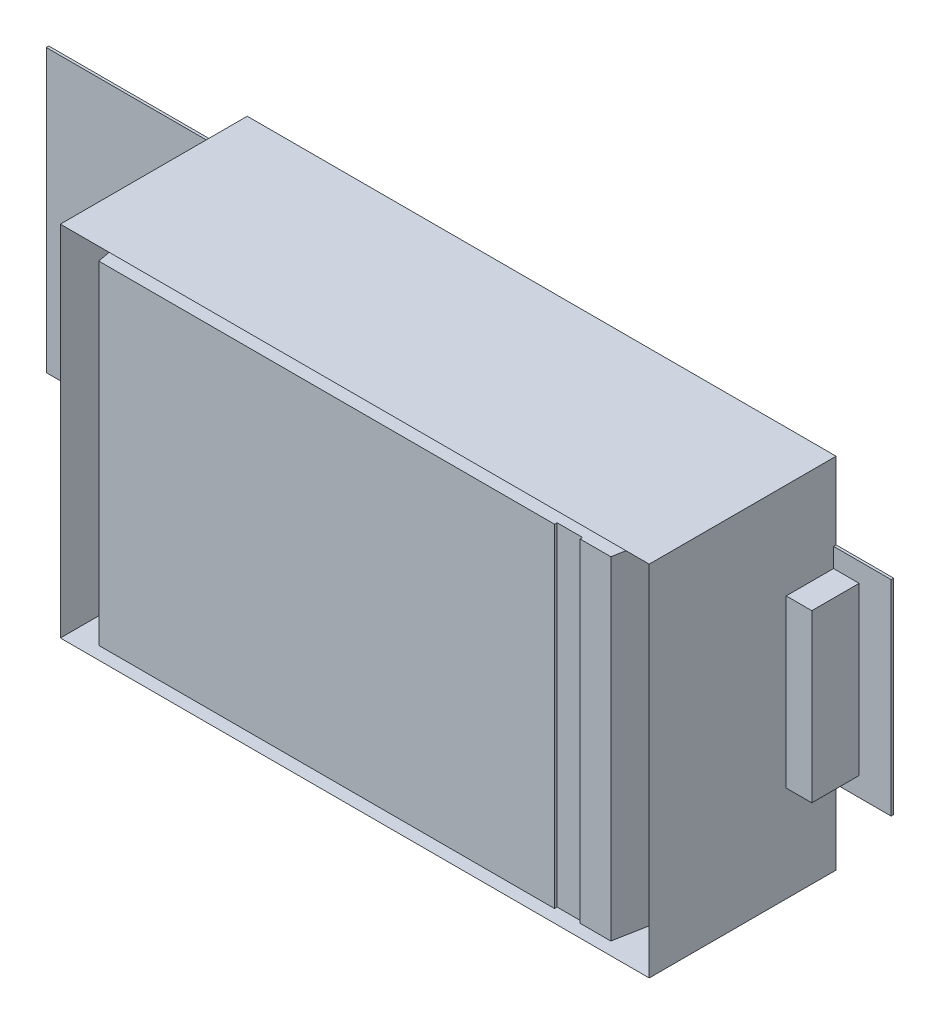
ISO-10303-21;
HEADER;
FILE_DESCRIPTION(('STEP AP214'),'2;1');
FILE_NAME('part.step','',(''),(''),'','','');
FILE_SCHEMA(('AUTOMOTIVE_DESIGN { 1 0 10303 214 1 1 1 1 }'));
ENDSEC;
DATA;
#1=APPLICATION_CONTEXT('core data for automotive mechanical design processes');
#2=APPLICATION_PROTOCOL_DEFINITION('international standard','automotive_design',2000,#1);
#3=PRODUCT_CONTEXT('',#1,'mechanical');
#4=PRODUCT('Part','Part','',(#3));
#5=PRODUCT_RELATED_PRODUCT_CATEGORY('part','',(#4));
#6=PRODUCT_DEFINITION_FORMATION('','',#4);
#7=PRODUCT_DEFINITION_CONTEXT('part definition',#1,'design');
#8=PRODUCT_DEFINITION('design','',#6,#7);
#9=PRODUCT_DEFINITION_SHAPE('','',#8);
#10=(LENGTH_UNIT() NAMED_UNIT(*) SI_UNIT(.MILLI.,.METRE.));
#11=(NAMED_UNIT(*) PLANE_ANGLE_UNIT() SI_UNIT($,.RADIAN.));
#12=(NAMED_UNIT(*) SI_UNIT($,.STERADIAN.) SOLID_ANGLE_UNIT());
#13=UNCERTAINTY_MEASURE_WITH_UNIT(LENGTH_MEASURE(1.E-05),#10,'distance_accuracy_value','');
#14=(GEOMETRIC_REPRESENTATION_CONTEXT(3) GLOBAL_UNCERTAINTY_ASSIGNED_CONTEXT((#13)) GLOBAL_UNIT_ASSIGNED_CONTEXT((#10,
#11,#12)) REPRESENTATION_CONTEXT('',''));
#15=CARTESIAN_POINT('',(0.,0.,0.));
#16=DIRECTION('',(0.,0.,1.));
#17=DIRECTION('',(1.,0.,0.));
#18=AXIS2_PLACEMENT_3D('',#15,#16,#17);
#19=CARTESIAN_POINT('',(-1.1,-0.65,0.2722));
#20=DIRECTION('',(0.982913837182173,0.,-0.184066261644595));
#21=DIRECTION('',(0.,-1.,0.));
#22=AXIS2_PLACEMENT_3D('',#19,#20,#21);
#23=PLANE('',#22);
#24=DIRECTION('',(0.,-1.,0.));
#25=VECTOR('',#24,1.);
#26=CARTESIAN_POINT('',(-1.1,0.65,0.2722));
#27=LINE('',#26,#25);
#28=CARTESIAN_POINT('',(-1.1,0.65,0.2722));
#29=VERTEX_POINT('',#28);
#30=CARTESIAN_POINT('',(-1.1,-0.65,0.2722));
#31=VERTEX_POINT('',#30);
#32=EDGE_CURVE('P0_E503',#29,#31,#27,.T.);
#33=ORIENTED_EDGE('',*,*,#32,.T.);
#34=DIRECTION('',(0.184066261644595,0.,0.982913837182173));
#35=VECTOR('',#34,1.);
#36=CARTESIAN_POINT('',(-1.1,-0.65,0.2722));
#37=LINE('',#36,#35);
#38=CARTESIAN_POINT('',(-1.,-0.65,0.8062));
#39=VERTEX_POINT('',#38);
#40=EDGE_CURVE('P0_E324',#31,#39,#37,.T.);
#41=ORIENTED_EDGE('',*,*,#40,.T.);
#42=DIRECTION('',(0.,1.,0.));
#43=VECTOR('',#42,1.);
#44=CARTESIAN_POINT('',(-1.,-0.65,0.8062));
#45=LINE('',#44,#43);
#46=CARTESIAN_POINT('',(-1.,0.65,0.8062));
#47=VERTEX_POINT('',#46);
#48=EDGE_CURVE('P0_E363',#39,#47,#45,.T.);
#49=ORIENTED_EDGE('',*,*,#48,.T.);
#50=DIRECTION('',(0.184066261644595,0.,0.982913837182173));
#51=VECTOR('',#50,1.);
#52=CARTESIAN_POINT('',(-1.1,0.65,0.2722));
#53=LINE('',#52,#51);
#54=EDGE_CURVE('P0_E449',#29,#47,#53,.T.);
#55=ORIENTED_EDGE('',*,*,#54,.F.);
#56=EDGE_LOOP('',(#33,#41,#49,#55));
#57=FACE_BOUND('',#56,.T.);
#58=ADVANCED_FACE('P0_F17',(#57),#23,.F.);
#59=CARTESIAN_POINT('',(1.25,-0.325,0.0762));
#60=DIRECTION('',(1.,0.,0.));
#61=DIRECTION('',(0.,1.,0.));
#62=AXIS2_PLACEMENT_3D('',#59,#60,#61);
#63=PLANE('',#62);
#64=DIRECTION('',(0.,0.,1.));
#65=VECTOR('',#64,1.);
#66=CARTESIAN_POINT('',(1.25,0.325,0.0862));
#67=LINE('',#66,#65);
#68=CARTESIAN_POINT('',(1.25,0.325,0.0862));
#69=VERTEX_POINT('',#68);
#70=CARTESIAN_POINT('',(1.25,0.325,0.2712));
#71=VERTEX_POINT('',#70);
#72=EDGE_CURVE('P0_E11',#69,#71,#67,.T.);
#73=ORIENTED_EDGE('',*,*,#72,.T.);
#74=DIRECTION('',(0.,1.,0.));
#75=VECTOR('',#74,1.);
#76=CARTESIAN_POINT('',(1.25,-0.325,0.2712));
#77=LINE('',#76,#75);
#78=CARTESIAN_POINT('',(1.25,-0.325,0.2712));
#79=VERTEX_POINT('',#78);
#80=EDGE_CURVE('P0_E329',#79,#71,#77,.T.);
#81=ORIENTED_EDGE('',*,*,#80,.F.);
#82=DIRECTION('',(0.,0.,1.));
#83=VECTOR('',#82,1.);
#84=CARTESIAN_POINT('',(1.25,-0.325,0.0862));
#85=LINE('',#84,#83);
#86=CARTESIAN_POINT('',(1.25,-0.325,0.0862));
#87=VERTEX_POINT('',#86);
#88=EDGE_CURVE('P0_E497',#87,#79,#85,.T.);
#89=ORIENTED_EDGE('',*,*,#88,.F.);
#90=DIRECTION('',(0.,1.,0.));
#91=VECTOR('',#90,1.);
#92=CARTESIAN_POINT('',(1.25,-0.325,0.0862));
#93=LINE('',#92,#91);
#94=EDGE_CURVE('P0_E337',#87,#69,#93,.T.);
#95=ORIENTED_EDGE('',*,*,#94,.T.);
#96=EDGE_LOOP('',(#73,#81,#89,#95));
#97=FACE_BOUND('',#96,.T.);
#98=ADVANCED_FACE('P0_F1200',(#97),#63,.T.);
#99=CARTESIAN_POINT('',(1.25,0.325,0.0762));
#100=DIRECTION('',(0.,1.,0.));
#101=DIRECTION('',(1.,0.,0.));
#102=AXIS2_PLACEMENT_3D('',#99,#100,#101);
#103=PLANE('',#102);
#104=DIRECTION('',(0.,0.,1.));
#105=VECTOR('',#104,1.);
#106=CARTESIAN_POINT('',(0.6,0.325,0.0862));
#107=LINE('',#106,#105);
#108=CARTESIAN_POINT('',(0.6,0.325,0.0862));
#109=VERTEX_POINT('',#108);
#110=CARTESIAN_POINT('',(0.6,0.325,0.1262));
#111=VERTEX_POINT('',#110);
#112=EDGE_CURVE('P0_E28',#109,#111,#107,.T.);
#113=ORIENTED_EDGE('',*,*,#112,.T.);
#114=DIRECTION('',(-1.,0.,0.));
#115=VECTOR('',#114,1.);
#116=CARTESIAN_POINT('',(1.1,0.325,0.1262));
#117=LINE('',#116,#115);
#118=CARTESIAN_POINT('',(1.1,0.325,0.1262));
#119=VERTEX_POINT('',#118);
#120=EDGE_CURVE('P0_E419',#119,#111,#117,.T.);
#121=ORIENTED_EDGE('',*,*,#120,.F.);
#122=DIRECTION('',(0.,0.,1.));
#123=VECTOR('',#122,1.);
#124=CARTESIAN_POINT('',(1.1,0.325,0.1262));
#125=LINE('',#124,#123);
#126=CARTESIAN_POINT('',(1.1,0.325,0.2712));
#127=VERTEX_POINT('',#126);
#128=EDGE_CURVE('P0_E418',#119,#127,#125,.T.);
#129=ORIENTED_EDGE('',*,*,#128,.T.);
#130=DIRECTION('',(-1.,0.,0.));
#131=VECTOR('',#130,1.);
#132=CARTESIAN_POINT('',(1.25,0.325,0.2712));
#133=LINE('',#132,#131);
#134=EDGE_CURVE('P0_E325',#71,#127,#133,.T.);
#135=ORIENTED_EDGE('',*,*,#134,.F.);
#136=ORIENTED_EDGE('',*,*,#72,.F.);
#137=DIRECTION('',(-1.,0.,0.));
#138=VECTOR('',#137,1.);
#139=CARTESIAN_POINT('',(1.25,0.325,0.0862));
#140=LINE('',#139,#138);
#141=EDGE_CURVE('P0_E399',#69,#109,#140,.T.);
#142=ORIENTED_EDGE('',*,*,#141,.T.);
#143=EDGE_LOOP('',(#113,#121,#129,#135,#136,#142));
#144=FACE_BOUND('',#143,.T.);
#145=ADVANCED_FACE('P0_F1196',(#144),#103,.T.);
#146=CARTESIAN_POINT('',(0.6,0.325,0.0762));
#147=DIRECTION('',(-1.,0.,0.));
#148=DIRECTION('',(0.,0.,1.));
#149=AXIS2_PLACEMENT_3D('',#146,#147,#148);
#150=PLANE('',#149);
#151=DIRECTION('',(0.,0.,1.));
#152=VECTOR('',#151,1.);
#153=CARTESIAN_POINT('',(0.6,-0.325,0.0862));
#154=LINE('',#153,#152);
#155=CARTESIAN_POINT('',(0.6,-0.325,0.0862));
#156=VERTEX_POINT('',#155);
#157=CARTESIAN_POINT('',(0.6,-0.325,0.1262));
#158=VERTEX_POINT('',#157);
#159=EDGE_CURVE('P0_E472',#156,#158,#154,.T.);
#160=ORIENTED_EDGE('',*,*,#159,.T.);
#161=DIRECTION('',(0.,-1.,0.));
#162=VECTOR('',#161,1.);
#163=CARTESIAN_POINT('',(0.6,0.325,0.1262));
#164=LINE('',#163,#162);
#165=EDGE_CURVE('P0_E423',#111,#158,#164,.T.);
#166=ORIENTED_EDGE('',*,*,#165,.F.);
#167=ORIENTED_EDGE('',*,*,#112,.F.);
#168=DIRECTION('',(0.,-1.,0.));
#169=VECTOR('',#168,1.);
#170=CARTESIAN_POINT('',(0.6,0.325,0.0862));
#171=LINE('',#170,#169);
#172=EDGE_CURVE('P0_E333',#109,#156,#171,.T.);
#173=ORIENTED_EDGE('',*,*,#172,.T.);
#174=EDGE_LOOP('',(#160,#166,#167,#173));
#175=FACE_BOUND('',#174,.T.);
#176=ADVANCED_FACE('P0_F1176',(#175),#150,.T.);
#177=CARTESIAN_POINT('',(1.1,-0.65,0.1262));
#178=DIRECTION('',(0.,0.,1.));
#179=DIRECTION('',(1.,0.,0.));
#180=AXIS2_PLACEMENT_3D('',#177,#178,#179);
#181=PLANE('',#180);
#182=DIRECTION('',(0.,1.,0.));
#183=VECTOR('',#182,1.);
#184=CARTESIAN_POINT('',(0.05,-0.325,0.1262));
#185=LINE('',#184,#183);
#186=CARTESIAN_POINT('',(0.05,-0.325,0.1262));
#187=VERTEX_POINT('',#186);
#188=CARTESIAN_POINT('',(0.05,0.325,0.1262));
#189=VERTEX_POINT('',#188);
#190=EDGE_CURVE('P0_E265',#187,#189,#185,.T.);
#191=ORIENTED_EDGE('',*,*,#190,.T.);
#192=DIRECTION('',(1.,0.,0.));
#193=VECTOR('',#192,1.);
#194=CARTESIAN_POINT('',(-1.1,0.325,0.1262));
#195=LINE('',#194,#193);
#196=CARTESIAN_POINT('',(-1.1,0.325,0.1262));
#197=VERTEX_POINT('',#196);
#198=EDGE_CURVE('P0_E261',#197,#189,#195,.T.);
#199=ORIENTED_EDGE('',*,*,#198,.F.);
#200=DIRECTION('',(0.,-1.,0.));
#201=VECTOR('',#200,1.);
#202=CARTESIAN_POINT('',(-1.1,0.65,0.1262));
#203=LINE('',#202,#201);
#204=CARTESIAN_POINT('',(-1.1,0.65,0.1262));
#205=VERTEX_POINT('',#204);
#206=EDGE_CURVE('P0_E424',#205,#197,#203,.T.);
#207=ORIENTED_EDGE('',*,*,#206,.F.);
#208=DIRECTION('',(-1.,0.,0.));
#209=VECTOR('',#208,1.);
#210=CARTESIAN_POINT('',(1.1,0.65,0.1262));
#211=LINE('',#210,#209);
#212=CARTESIAN_POINT('',(1.1,0.65,0.1262));
#213=VERTEX_POINT('',#212);
#214=EDGE_CURVE('P0_E557',#213,#205,#211,.T.);
#215=ORIENTED_EDGE('',*,*,#214,.F.);
#216=DIRECTION('',(0.,1.,0.));
#217=VECTOR('',#216,1.);
#218=CARTESIAN_POINT('',(1.1,0.325,0.1262));
#219=LINE('',#218,#217);
#220=EDGE_CURVE('P0_E383',#119,#213,#219,.T.);
#221=ORIENTED_EDGE('',*,*,#220,.F.);
#222=ORIENTED_EDGE('',*,*,#120,.T.);
#223=ORIENTED_EDGE('',*,*,#165,.T.);
#224=DIRECTION('',(-1.,0.,0.));
#225=VECTOR('',#224,1.);
#226=CARTESIAN_POINT('',(1.1,-0.325,0.1262));
#227=LINE('',#226,#225);
#228=CARTESIAN_POINT('',(1.1,-0.325,0.1262));
#229=VERTEX_POINT('',#228);
#230=EDGE_CURVE('P0_E477',#229,#158,#227,.T.);
#231=ORIENTED_EDGE('',*,*,#230,.F.);
#232=DIRECTION('',(0.,1.,0.));
#233=VECTOR('',#232,1.);
#234=CARTESIAN_POINT('',(1.1,-0.65,0.1262));
#235=LINE('',#234,#233);
#236=CARTESIAN_POINT('',(1.1,-0.65,0.1262));
#237=VERTEX_POINT('',#236);
#238=EDGE_CURVE('P0_E378',#237,#229,#235,.T.);
#239=ORIENTED_EDGE('',*,*,#238,.F.);
#240=DIRECTION('',(1.,0.,0.));
#241=VECTOR('',#240,1.);
#242=CARTESIAN_POINT('',(-1.1,-0.65,0.1262));
#243=LINE('',#242,#241);
#244=CARTESIAN_POINT('',(-1.1,-0.65,0.1262));
#245=VERTEX_POINT('',#244);
#246=EDGE_CURVE('P0_E323',#245,#237,#243,.T.);
#247=ORIENTED_EDGE('',*,*,#246,.F.);
#248=DIRECTION('',(0.,-1.,0.));
#249=VECTOR('',#248,1.);
#250=CARTESIAN_POINT('',(-1.1,-0.325,0.1262));
#251=LINE('',#250,#249);
#252=CARTESIAN_POINT('',(-1.1,-0.325,0.1262));
#253=VERTEX_POINT('',#252);
#254=EDGE_CURVE('P0_E328',#253,#245,#251,.T.);
#255=ORIENTED_EDGE('',*,*,#254,.F.);
#256=DIRECTION('',(1.,0.,0.));
#257=VECTOR('',#256,1.);
#258=CARTESIAN_POINT('',(-1.1,-0.325,0.1262));
#259=LINE('',#258,#257);
#260=EDGE_CURVE('P0_E407',#253,#187,#259,.T.);
#261=ORIENTED_EDGE('',*,*,#260,.T.);
#262=EDGE_LOOP('',(#191,#199,#207,#215,#221,#222,#223,#231,#239,#247,#255,#261));
#263=FACE_BOUND('',#262,.T.);
#264=ADVANCED_FACE('P0_F1170',(#263),#181,.F.);
#265=CARTESIAN_POINT('',(-1.1,0.65,0.0762));
#266=DIRECTION('',(-1.,0.,0.));
#267=DIRECTION('',(0.,0.,1.));
#268=AXIS2_PLACEMENT_3D('',#265,#266,#267);
#269=PLANE('',#268);
#270=ORIENTED_EDGE('',*,*,#254,.T.);
#271=DIRECTION('',(0.,0.,1.));
#272=VECTOR('',#271,1.);
#273=CARTESIAN_POINT('',(-1.1,-0.65,0.1262));
#274=LINE('',#273,#272);
#275=EDGE_CURVE('P0_E319',#245,#31,#274,.T.);
#276=ORIENTED_EDGE('',*,*,#275,.T.);
#277=ORIENTED_EDGE('',*,*,#32,.F.);
#278=DIRECTION('',(0.,0.,1.));
#279=VECTOR('',#278,1.);
#280=CARTESIAN_POINT('',(-1.1,0.65,0.1262));
#281=LINE('',#280,#279);
#282=EDGE_CURVE('P0_E297',#205,#29,#281,.T.);
#283=ORIENTED_EDGE('',*,*,#282,.F.);
#284=ORIENTED_EDGE('',*,*,#206,.T.);
#285=DIRECTION('',(0.,0.,1.));
#286=VECTOR('',#285,1.);
#287=CARTESIAN_POINT('',(-1.1,0.325,0.1262));
#288=LINE('',#287,#286);
#289=CARTESIAN_POINT('',(-1.1,0.325,0.2712));
#290=VERTEX_POINT('',#289);
#291=EDGE_CURVE('P0_E448',#197,#290,#288,.T.);
#292=ORIENTED_EDGE('',*,*,#291,.T.);
#293=DIRECTION('',(0.,1.,0.));
#294=VECTOR('',#293,1.);
#295=CARTESIAN_POINT('',(-1.1,-0.325,0.2712));
#296=LINE('',#295,#294);
#297=CARTESIAN_POINT('',(-1.1,-0.325,0.2712));
#298=VERTEX_POINT('',#297);
#299=EDGE_CURVE('P0_E408',#298,#290,#296,.T.);
#300=ORIENTED_EDGE('',*,*,#299,.F.);
#301=DIRECTION('',(0.,0.,1.));
#302=VECTOR('',#301,1.);
#303=CARTESIAN_POINT('',(-1.1,-0.325,0.1262));
#304=LINE('',#303,#302);
#305=EDGE_CURVE('P0_E432',#253,#298,#304,.T.);
#306=ORIENTED_EDGE('',*,*,#305,.F.);
#307=EDGE_LOOP('',(#270,#276,#277,#283,#284,#292,#300,#306));
#308=FACE_BOUND('',#307,.T.);
#309=ADVANCED_FACE('P0_F1175',(#308),#269,.T.);
#310=CARTESIAN_POINT('',(0.,0.,0.2712));
#311=DIRECTION('',(0.,0.,1.));
#312=DIRECTION('',(1.,0.,0.));
#313=AXIS2_PLACEMENT_3D('',#310,#311,#312);
#314=PLANE('',#313);
#315=ORIENTED_EDGE('',*,*,#80,.T.);
#316=ORIENTED_EDGE('',*,*,#134,.T.);
#317=DIRECTION('',(0.,1.,0.));
#318=VECTOR('',#317,1.);
#319=CARTESIAN_POINT('',(1.1,-0.325,0.2712));
#320=LINE('',#319,#318);
#321=CARTESIAN_POINT('',(1.1,-0.325,0.2712));
#322=VERTEX_POINT('',#321);
#323=EDGE_CURVE('P0_E441',#322,#127,#320,.T.);
#324=ORIENTED_EDGE('',*,*,#323,.F.);
#325=DIRECTION('',(1.,0.,0.));
#326=VECTOR('',#325,1.);
#327=CARTESIAN_POINT('',(1.1,-0.325,0.2712));
#328=LINE('',#327,#326);
#329=EDGE_CURVE('P0_E481',#322,#79,#328,.T.);
#330=ORIENTED_EDGE('',*,*,#329,.T.);
#331=EDGE_LOOP('',(#315,#316,#324,#330));
#332=FACE_BOUND('',#331,.T.);
#333=ADVANCED_FACE('P0_F1397',(#332),#314,.T.);
#334=CARTESIAN_POINT('',(0.,0.,0.2712));
#335=DIRECTION('',(0.,0.,1.));
#336=DIRECTION('',(1.,0.,0.));
#337=AXIS2_PLACEMENT_3D('',#334,#335,#336);
#338=PLANE('',#337);
#339=ORIENTED_EDGE('',*,*,#299,.T.);
#340=DIRECTION('',(-1.,0.,0.));
#341=VECTOR('',#340,1.);
#342=CARTESIAN_POINT('',(-1.1,0.325,0.2712));
#343=LINE('',#342,#341);
#344=CARTESIAN_POINT('',(-1.25,0.325,0.2712));
#345=VERTEX_POINT('',#344);
#346=EDGE_CURVE('P0_E404',#290,#345,#343,.T.);
#347=ORIENTED_EDGE('',*,*,#346,.T.);
#348=DIRECTION('',(0.,-1.,0.));
#349=VECTOR('',#348,1.);
#350=CARTESIAN_POINT('',(-1.25,0.325,0.2712));
#351=LINE('',#350,#349);
#352=CARTESIAN_POINT('',(-1.25,-0.325,0.2712));
#353=VERTEX_POINT('',#352);
#354=EDGE_CURVE('P0_E394',#345,#353,#351,.T.);
#355=ORIENTED_EDGE('',*,*,#354,.T.);
#356=DIRECTION('',(1.,0.,0.));
#357=VECTOR('',#356,1.);
#358=CARTESIAN_POINT('',(-1.25,-0.325,0.2712));
#359=LINE('',#358,#357);
#360=EDGE_CURVE('P0_E411',#353,#298,#359,.T.);
#361=ORIENTED_EDGE('',*,*,#360,.T.);
#362=EDGE_LOOP('',(#339,#347,#355,#361));
#363=FACE_BOUND('',#362,.T.);
#364=ADVANCED_FACE('P0_F19',(#363),#338,.T.);
#365=CARTESIAN_POINT('',(-1.25,-0.325,0.0762));
#366=DIRECTION('',(0.,-1.,0.));
#367=DIRECTION('',(0.,0.,-1.));
#368=AXIS2_PLACEMENT_3D('',#365,#366,#367);
#369=PLANE('',#368);
#370=DIRECTION('',(0.,0.,1.));
#371=VECTOR('',#370,1.);
#372=CARTESIAN_POINT('',(0.05,-0.325,0.0862));
#373=LINE('',#372,#371);
#374=CARTESIAN_POINT('',(0.05,-0.325,0.0862));
#375=VERTEX_POINT('',#374);
#376=EDGE_CURVE('P0_E271',#375,#187,#373,.T.);
#377=ORIENTED_EDGE('',*,*,#376,.T.);
#378=ORIENTED_EDGE('',*,*,#260,.F.);
#379=ORIENTED_EDGE('',*,*,#305,.T.);
#380=ORIENTED_EDGE('',*,*,#360,.F.);
#381=DIRECTION('',(0.,0.,1.));
#382=VECTOR('',#381,1.);
#383=CARTESIAN_POINT('',(-1.25,-0.325,0.0862));
#384=LINE('',#383,#382);
#385=CARTESIAN_POINT('',(-1.25,-0.325,0.0862));
#386=VERTEX_POINT('',#385);
#387=EDGE_CURVE('P0_E317',#386,#353,#384,.T.);
#388=ORIENTED_EDGE('',*,*,#387,.F.);
#389=DIRECTION('',(1.,0.,0.));
#390=VECTOR('',#389,1.);
#391=CARTESIAN_POINT('',(-1.25,-0.325,0.0862));
#392=LINE('',#391,#390);
#393=EDGE_CURVE('P0_E276',#386,#375,#392,.T.);
#394=ORIENTED_EDGE('',*,*,#393,.T.);
#395=EDGE_LOOP('',(#377,#378,#379,#380,#388,#394));
#396=FACE_BOUND('',#395,.T.);
#397=ADVANCED_FACE('P0_F1311',(#396),#369,.T.);
#398=CARTESIAN_POINT('',(0.05,-0.325,0.0762));
#399=DIRECTION('',(1.,0.,0.));
#400=DIRECTION('',(0.,1.,0.));
#401=AXIS2_PLACEMENT_3D('',#398,#399,#400);
#402=PLANE('',#401);
#403=DIRECTION('',(0.,0.,1.));
#404=VECTOR('',#403,1.);
#405=CARTESIAN_POINT('',(0.05,0.325,0.0862));
#406=LINE('',#405,#404);
#407=CARTESIAN_POINT('',(0.05,0.325,0.0862));
#408=VERTEX_POINT('',#407);
#409=EDGE_CURVE('P0_E253',#408,#189,#406,.T.);
#410=ORIENTED_EDGE('',*,*,#409,.T.);
#411=ORIENTED_EDGE('',*,*,#190,.F.);
#412=ORIENTED_EDGE('',*,*,#376,.F.);
#413=DIRECTION('',(0.,1.,0.));
#414=VECTOR('',#413,1.);
#415=CARTESIAN_POINT('',(0.05,-0.325,0.0862));
#416=LINE('',#415,#414);
#417=EDGE_CURVE('P0_E268',#375,#408,#416,.T.);
#418=ORIENTED_EDGE('',*,*,#417,.T.);
#419=EDGE_LOOP('',(#410,#411,#412,#418));
#420=FACE_BOUND('',#419,.T.);
#421=ADVANCED_FACE('P0_F269',(#420),#402,.T.);
#422=CARTESIAN_POINT('',(0.05,0.325,0.0762));
#423=DIRECTION('',(0.,1.,0.));
#424=DIRECTION('',(1.,0.,0.));
#425=AXIS2_PLACEMENT_3D('',#422,#423,#424);
#426=PLANE('',#425);
#427=DIRECTION('',(0.,0.,1.));
#428=VECTOR('',#427,1.);
#429=CARTESIAN_POINT('',(-1.25,0.325,0.0862));
#430=LINE('',#429,#428);
#431=CARTESIAN_POINT('',(-1.25,0.325,0.0862));
#432=VERTEX_POINT('',#431);
#433=EDGE_CURVE('P0_E398',#432,#345,#430,.T.);
#434=ORIENTED_EDGE('',*,*,#433,.T.);
#435=ORIENTED_EDGE('',*,*,#346,.F.);
#436=ORIENTED_EDGE('',*,*,#291,.F.);
#437=ORIENTED_EDGE('',*,*,#198,.T.);
#438=ORIENTED_EDGE('',*,*,#409,.F.);
#439=DIRECTION('',(-1.,0.,0.));
#440=VECTOR('',#439,1.);
#441=CARTESIAN_POINT('',(0.05,0.325,0.0862));
#442=LINE('',#441,#440);
#443=EDGE_CURVE('P0_E258',#408,#432,#442,.T.);
#444=ORIENTED_EDGE('',*,*,#443,.T.);
#445=EDGE_LOOP('',(#434,#435,#436,#437,#438,#444));
#446=FACE_BOUND('',#445,.T.);
#447=ADVANCED_FACE('P0_F256',(#446),#426,.T.);
#448=CARTESIAN_POINT('',(-1.25,0.325,0.0762));
#449=DIRECTION('',(-1.,0.,0.));
#450=DIRECTION('',(0.,0.,1.));
#451=AXIS2_PLACEMENT_3D('',#448,#449,#450);
#452=PLANE('',#451);
#453=ORIENTED_EDGE('',*,*,#387,.T.);
#454=ORIENTED_EDGE('',*,*,#354,.F.);
#455=ORIENTED_EDGE('',*,*,#433,.F.);
#456=DIRECTION('',(0.,-1.,0.));
#457=VECTOR('',#456,1.);
#458=CARTESIAN_POINT('',(-1.25,0.325,0.0862));
#459=LINE('',#458,#457);
#460=EDGE_CURVE('P0_E282',#432,#386,#459,.T.);
#461=ORIENTED_EDGE('',*,*,#460,.T.);
#462=EDGE_LOOP('',(#453,#454,#455,#461));
#463=FACE_BOUND('',#462,.T.);
#464=ADVANCED_FACE('P0_F1247',(#463),#452,.T.);
#465=CARTESIAN_POINT('',(1.375,0.4,0.0762));
#466=DIRECTION('',(0.,1.,0.));
#467=DIRECTION('',(1.,0.,0.));
#468=AXIS2_PLACEMENT_3D('',#465,#466,#467);
#469=PLANE('',#468);
#470=DIRECTION('',(0.,0.,1.));
#471=VECTOR('',#470,1.);
#472=CARTESIAN_POINT('',(0.575,0.4,0.0762));
#473=LINE('',#472,#471);
#474=CARTESIAN_POINT('',(0.575,0.4,0.0762));
#475=VERTEX_POINT('',#474);
#476=CARTESIAN_POINT('',(0.575,0.4,0.0862));
#477=VERTEX_POINT('',#476);
#478=EDGE_CURVE('P0_E343',#475,#477,#473,.T.);
#479=ORIENTED_EDGE('',*,*,#478,.T.);
#480=DIRECTION('',(-1.,0.,0.));
#481=VECTOR('',#480,1.);
#482=CARTESIAN_POINT('',(1.375,0.4,0.0862));
#483=LINE('',#482,#481);
#484=CARTESIAN_POINT('',(1.375,0.4,0.0862));
#485=VERTEX_POINT('',#484);
#486=EDGE_CURVE('P0_E384',#485,#477,#483,.T.);
#487=ORIENTED_EDGE('',*,*,#486,.F.);
#488=DIRECTION('',(0.,0.,1.));
#489=VECTOR('',#488,1.);
#490=CARTESIAN_POINT('',(1.375,0.4,0.0762));
#491=LINE('',#490,#489);
#492=CARTESIAN_POINT('',(1.375,0.4,0.0762));
#493=VERTEX_POINT('',#492);
#494=EDGE_CURVE('P0_E314',#493,#485,#491,.T.);
#495=ORIENTED_EDGE('',*,*,#494,.F.);
#496=DIRECTION('',(-1.,0.,0.));
#497=VECTOR('',#496,1.);
#498=CARTESIAN_POINT('',(1.375,0.4,0.0762));
#499=LINE('',#498,#497);
#500=EDGE_CURVE('P0_E412',#493,#475,#499,.T.);
#501=ORIENTED_EDGE('',*,*,#500,.T.);
#502=EDGE_LOOP('',(#479,#487,#495,#501));
#503=FACE_BOUND('',#502,.T.);
#504=ADVANCED_FACE('P0_F1252',(#503),#469,.T.);
#505=CARTESIAN_POINT('',(1.375,-0.4,0.0762));
#506=DIRECTION('',(1.,0.,0.));
#507=DIRECTION('',(0.,1.,0.));
#508=AXIS2_PLACEMENT_3D('',#505,#506,#507);
#509=PLANE('',#508);
#510=ORIENTED_EDGE('',*,*,#494,.T.);
#511=DIRECTION('',(0.,1.,0.));
#512=VECTOR('',#511,1.);
#513=CARTESIAN_POINT('',(1.375,-0.4,0.0862));
#514=LINE('',#513,#512);
#515=CARTESIAN_POINT('',(1.375,-0.4,0.0862));
#516=VERTEX_POINT('',#515);
#517=EDGE_CURVE('P0_E389',#516,#485,#514,.T.);
#518=ORIENTED_EDGE('',*,*,#517,.F.);
#519=DIRECTION('',(0.,0.,1.));
#520=VECTOR('',#519,1.);
#521=CARTESIAN_POINT('',(1.375,-0.4,0.0762));
#522=LINE('',#521,#520);
#523=CARTESIAN_POINT('',(1.375,-0.4,0.0762));
#524=VERTEX_POINT('',#523);
#525=EDGE_CURVE('P0_E318',#524,#516,#522,.T.);
#526=ORIENTED_EDGE('',*,*,#525,.F.);
#527=DIRECTION('',(0.,1.,0.));
#528=VECTOR('',#527,1.);
#529=CARTESIAN_POINT('',(1.375,-0.4,0.0762));
#530=LINE('',#529,#528);
#531=EDGE_CURVE('P0_E313',#524,#493,#530,.T.);
#532=ORIENTED_EDGE('',*,*,#531,.T.);
#533=EDGE_LOOP('',(#510,#518,#526,#532));
#534=FACE_BOUND('',#533,.T.);
#535=ADVANCED_FACE('P0_F1275',(#534),#509,.T.);
#536=CARTESIAN_POINT('',(0.575,-0.4,0.0762));
#537=DIRECTION('',(0.,-1.,0.));
#538=DIRECTION('',(0.,0.,-1.));
#539=AXIS2_PLACEMENT_3D('',#536,#537,#538);
#540=PLANE('',#539);
#541=ORIENTED_EDGE('',*,*,#525,.T.);
#542=DIRECTION('',(1.,0.,0.));
#543=VECTOR('',#542,1.);
#544=CARTESIAN_POINT('',(0.575,-0.4,0.0862));
#545=LINE('',#544,#543);
#546=CARTESIAN_POINT('',(0.575,-0.4,0.0862));
#547=VERTEX_POINT('',#546);
#548=EDGE_CURVE('P0_E393',#547,#516,#545,.T.);
#549=ORIENTED_EDGE('',*,*,#548,.F.);
#550=DIRECTION('',(0.,0.,1.));
#551=VECTOR('',#550,1.);
#552=CARTESIAN_POINT('',(0.575,-0.4,0.0762));
#553=LINE('',#552,#551);
#554=CARTESIAN_POINT('',(0.575,-0.4,0.0762));
#555=VERTEX_POINT('',#554);
#556=EDGE_CURVE('P0_E332',#555,#547,#553,.T.);
#557=ORIENTED_EDGE('',*,*,#556,.F.);
#558=DIRECTION('',(1.,0.,0.));
#559=VECTOR('',#558,1.);
#560=CARTESIAN_POINT('',(0.575,-0.4,0.0762));
#561=LINE('',#560,#559);
#562=EDGE_CURVE('P0_E308',#555,#524,#561,.T.);
#563=ORIENTED_EDGE('',*,*,#562,.T.);
#564=EDGE_LOOP('',(#541,#549,#557,#563));
#565=FACE_BOUND('',#564,.T.);
#566=ADVANCED_FACE('P0_F1341',(#565),#540,.T.);
#567=CARTESIAN_POINT('',(-1.925,0.55,0.0762));
#568=DIRECTION('',(-1.,0.,0.));
#569=DIRECTION('',(0.,0.,1.));
#570=AXIS2_PLACEMENT_3D('',#567,#568,#569);
#571=PLANE('',#570);
#572=DIRECTION('',(0.,0.,1.));
#573=VECTOR('',#572,1.);
#574=CARTESIAN_POINT('',(-1.925,-0.55,0.0762));
#575=LINE('',#574,#573);
#576=CARTESIAN_POINT('',(-1.925,-0.55,0.0762));
#577=VERTEX_POINT('',#576);
#578=CARTESIAN_POINT('',(-1.925,-0.55,0.0862));
#579=VERTEX_POINT('',#578);
#580=EDGE_CURVE('P0_E350',#577,#579,#575,.T.);
#581=ORIENTED_EDGE('',*,*,#580,.T.);
#582=DIRECTION('',(0.,-1.,0.));
#583=VECTOR('',#582,1.);
#584=CARTESIAN_POINT('',(-1.925,0.55,0.0862));
#585=LINE('',#584,#583);
#586=CARTESIAN_POINT('',(-1.925,0.55,0.0862));
#587=VERTEX_POINT('',#586);
#588=EDGE_CURVE('P0_E302',#587,#579,#585,.T.);
#589=ORIENTED_EDGE('',*,*,#588,.F.);
#590=DIRECTION('',(0.,0.,1.));
#591=VECTOR('',#590,1.);
#592=CARTESIAN_POINT('',(-1.925,0.55,0.0762));
#593=LINE('',#592,#591);
#594=CARTESIAN_POINT('',(-1.925,0.55,0.0762));
#595=VERTEX_POINT('',#594);
#596=EDGE_CURVE('P0_E312',#595,#587,#593,.T.);
#597=ORIENTED_EDGE('',*,*,#596,.F.);
#598=DIRECTION('',(0.,-1.,0.));
#599=VECTOR('',#598,1.);
#600=CARTESIAN_POINT('',(-1.925,0.55,0.0762));
#601=LINE('',#600,#599);
#602=EDGE_CURVE('P0_E21',#595,#577,#601,.T.);
#603=ORIENTED_EDGE('',*,*,#602,.T.);
#604=EDGE_LOOP('',(#581,#589,#597,#603));
#605=FACE_BOUND('',#604,.T.);
#606=ADVANCED_FACE('P0_F1265',(#605),#571,.T.);
#607=CARTESIAN_POINT('',(-1.925,-0.55,0.0762));
#608=DIRECTION('',(0.,-1.,0.));
#609=DIRECTION('',(0.,0.,-1.));
#610=AXIS2_PLACEMENT_3D('',#607,#608,#609);
#611=PLANE('',#610);
#612=DIRECTION('',(0.,0.,1.));
#613=VECTOR('',#612,1.);
#614=CARTESIAN_POINT('',(0.075,-0.55,0.0762));
#615=LINE('',#614,#613);
#616=CARTESIAN_POINT('',(0.075,-0.55,0.0762));
#617=VERTEX_POINT('',#616);
#618=CARTESIAN_POINT('',(0.075,-0.55,0.0862));
#619=VERTEX_POINT('',#618);
#620=EDGE_CURVE('P0_E347',#617,#619,#615,.T.);
#621=ORIENTED_EDGE('',*,*,#620,.T.);
#622=DIRECTION('',(1.,0.,0.));
#623=VECTOR('',#622,1.);
#624=CARTESIAN_POINT('',(-1.925,-0.55,0.0862));
#625=LINE('',#624,#623);
#626=EDGE_CURVE('P0_E299',#579,#619,#625,.T.);
#627=ORIENTED_EDGE('',*,*,#626,.F.);
#628=ORIENTED_EDGE('',*,*,#580,.F.);
#629=DIRECTION('',(1.,0.,0.));
#630=VECTOR('',#629,1.);
#631=CARTESIAN_POINT('',(-1.925,-0.55,0.0762));
#632=LINE('',#631,#630);
#633=EDGE_CURVE('P0_E549',#577,#617,#632,.T.);
#634=ORIENTED_EDGE('',*,*,#633,.T.);
#635=EDGE_LOOP('',(#621,#627,#628,#634));
#636=FACE_BOUND('',#635,.T.);
#637=ADVANCED_FACE('P0_F1260',(#636),#611,.T.);
#638=CARTESIAN_POINT('',(0.075,-0.55,0.0762));
#639=DIRECTION('',(1.,0.,0.));
#640=DIRECTION('',(0.,1.,0.));
#641=AXIS2_PLACEMENT_3D('',#638,#639,#640);
#642=PLANE('',#641);
#643=DIRECTION('',(0.,0.,1.));
#644=VECTOR('',#643,1.);
#645=CARTESIAN_POINT('',(0.075,0.55,0.0762));
#646=LINE('',#645,#644);
#647=CARTESIAN_POINT('',(0.075,0.55,0.0762));
#648=VERTEX_POINT('',#647);
#649=CARTESIAN_POINT('',(0.075,0.55,0.0862));
#650=VERTEX_POINT('',#649);
#651=EDGE_CURVE('P0_E351',#648,#650,#646,.T.);
#652=ORIENTED_EDGE('',*,*,#651,.T.);
#653=DIRECTION('',(0.,1.,0.));
#654=VECTOR('',#653,1.);
#655=CARTESIAN_POINT('',(0.075,-0.55,0.0862));
#656=LINE('',#655,#654);
#657=EDGE_CURVE('P0_E293',#619,#650,#656,.T.);
#658=ORIENTED_EDGE('',*,*,#657,.F.);
#659=ORIENTED_EDGE('',*,*,#620,.F.);
#660=DIRECTION('',(0.,1.,0.));
#661=VECTOR('',#660,1.);
#662=CARTESIAN_POINT('',(0.075,-0.55,0.0762));
#663=LINE('',#662,#661);
#664=EDGE_CURVE('P0_E553',#617,#648,#663,.T.);
#665=ORIENTED_EDGE('',*,*,#664,.T.);
#666=EDGE_LOOP('',(#652,#658,#659,#665));
#667=FACE_BOUND('',#666,.T.);
#668=ADVANCED_FACE('P0_F1264',(#667),#642,.T.);
#669=CARTESIAN_POINT('',(0.075,0.55,0.0762));
#670=DIRECTION('',(0.,1.,0.));
#671=DIRECTION('',(1.,0.,0.));
#672=AXIS2_PLACEMENT_3D('',#669,#670,#671);
#673=PLANE('',#672);
#674=ORIENTED_EDGE('',*,*,#596,.T.);
#675=DIRECTION('',(-1.,0.,0.));
#676=VECTOR('',#675,1.);
#677=CARTESIAN_POINT('',(0.075,0.55,0.0862));
#678=LINE('',#677,#676);
#679=EDGE_CURVE('P0_E284',#650,#587,#678,.T.);
#680=ORIENTED_EDGE('',*,*,#679,.F.);
#681=ORIENTED_EDGE('',*,*,#651,.F.);
#682=DIRECTION('',(-1.,0.,0.));
#683=VECTOR('',#682,1.);
#684=CARTESIAN_POINT('',(0.075,0.55,0.0762));
#685=LINE('',#684,#683);
#686=EDGE_CURVE('P0_E415',#648,#595,#685,.T.);
#687=ORIENTED_EDGE('',*,*,#686,.T.);
#688=EDGE_LOOP('',(#674,#680,#681,#687));
#689=FACE_BOUND('',#688,.T.);
#690=ADVANCED_FACE('P0_F1290',(#689),#673,.T.);
#691=CARTESIAN_POINT('',(0.,0.,0.0762));
#692=DIRECTION('',(0.,0.,1.));
#693=DIRECTION('',(1.,0.,0.));
#694=AXIS2_PLACEMENT_3D('',#691,#692,#693);
#695=PLANE('',#694);
#696=ORIENTED_EDGE('',*,*,#500,.F.);
#697=ORIENTED_EDGE('',*,*,#531,.F.);
#698=ORIENTED_EDGE('',*,*,#562,.F.);
#699=DIRECTION('',(0.,-1.,0.));
#700=VECTOR('',#699,1.);
#701=CARTESIAN_POINT('',(0.575,0.4,0.0762));
#702=LINE('',#701,#700);
#703=EDGE_CURVE('P0_E346',#475,#555,#702,.T.);
#704=ORIENTED_EDGE('',*,*,#703,.F.);
#705=EDGE_LOOP('',(#696,#697,#698,#704));
#706=FACE_BOUND('',#705,.T.);
#707=ADVANCED_FACE('P0_F1295',(#706),#695,.F.);
#708=CARTESIAN_POINT('',(0.,0.,0.0762));
#709=DIRECTION('',(0.,0.,1.));
#710=DIRECTION('',(1.,0.,0.));
#711=AXIS2_PLACEMENT_3D('',#708,#709,#710);
#712=PLANE('',#711);
#713=ORIENTED_EDGE('',*,*,#664,.F.);
#714=ORIENTED_EDGE('',*,*,#633,.F.);
#715=ORIENTED_EDGE('',*,*,#602,.F.);
#716=ORIENTED_EDGE('',*,*,#686,.F.);
#717=EDGE_LOOP('',(#713,#714,#715,#716));
#718=FACE_BOUND('',#717,.T.);
#719=ADVANCED_FACE('P0_F1188',(#718),#712,.F.);
#720=CARTESIAN_POINT('',(0.575,0.4,0.0762));
#721=DIRECTION('',(-1.,0.,0.));
#722=DIRECTION('',(0.,0.,1.));
#723=AXIS2_PLACEMENT_3D('',#720,#721,#722);
#724=PLANE('',#723);
#725=ORIENTED_EDGE('',*,*,#556,.T.);
#726=DIRECTION('',(0.,-1.,0.));
#727=VECTOR('',#726,1.);
#728=CARTESIAN_POINT('',(0.575,0.4,0.0862));
#729=LINE('',#728,#727);
#730=EDGE_CURVE('P0_E388',#477,#547,#729,.T.);
#731=ORIENTED_EDGE('',*,*,#730,.F.);
#732=ORIENTED_EDGE('',*,*,#478,.F.);
#733=ORIENTED_EDGE('',*,*,#703,.T.);
#734=EDGE_LOOP('',(#725,#731,#732,#733));
#735=FACE_BOUND('',#734,.T.);
#736=ADVANCED_FACE('P0_F1183',(#735),#724,.T.);
#737=CARTESIAN_POINT('',(0.,0.,0.0862));
#738=DIRECTION('',(0.,0.,1.));
#739=DIRECTION('',(1.,0.,0.));
#740=AXIS2_PLACEMENT_3D('',#737,#738,#739);
#741=PLANE('',#740);
#742=ORIENTED_EDGE('',*,*,#443,.F.);
#743=ORIENTED_EDGE('',*,*,#417,.F.);
#744=ORIENTED_EDGE('',*,*,#393,.F.);
#745=ORIENTED_EDGE('',*,*,#460,.F.);
#746=EDGE_LOOP('',(#742,#743,#744,#745));
#747=FACE_BOUND('',#746,.T.);
#748=ORIENTED_EDGE('',*,*,#588,.T.);
#749=ORIENTED_EDGE('',*,*,#626,.T.);
#750=ORIENTED_EDGE('',*,*,#657,.T.);
#751=ORIENTED_EDGE('',*,*,#679,.T.);
#752=EDGE_LOOP('',(#748,#749,#750,#751));
#753=FACE_BOUND('',#752,.T.);
#754=ADVANCED_FACE('P0_F279',(#747,#753),#741,.T.);
#755=CARTESIAN_POINT('',(0.,0.,0.0862));
#756=DIRECTION('',(0.,0.,1.));
#757=DIRECTION('',(1.,0.,0.));
#758=AXIS2_PLACEMENT_3D('',#755,#756,#757);
#759=PLANE('',#758);
#760=ORIENTED_EDGE('',*,*,#141,.F.);
#761=ORIENTED_EDGE('',*,*,#94,.F.);
#762=DIRECTION('',(1.,0.,0.));
#763=VECTOR('',#762,1.);
#764=CARTESIAN_POINT('',(0.6,-0.325,0.0862));
#765=LINE('',#764,#763);
#766=EDGE_CURVE('P0_E476',#156,#87,#765,.T.);
#767=ORIENTED_EDGE('',*,*,#766,.F.);
#768=ORIENTED_EDGE('',*,*,#172,.F.);
#769=EDGE_LOOP('',(#760,#761,#767,#768));
#770=FACE_BOUND('',#769,.T.);
#771=ORIENTED_EDGE('',*,*,#548,.T.);
#772=ORIENTED_EDGE('',*,*,#517,.T.);
#773=ORIENTED_EDGE('',*,*,#486,.T.);
#774=ORIENTED_EDGE('',*,*,#730,.T.);
#775=EDGE_LOOP('',(#771,#772,#773,#774));
#776=FACE_BOUND('',#775,.T.);
#777=ADVANCED_FACE('P0_F1333',(#770,#776),#759,.T.);
#778=CARTESIAN_POINT('',(0.6,-0.325,0.0762));
#779=DIRECTION('',(0.,-1.,0.));
#780=DIRECTION('',(0.,0.,-1.));
#781=AXIS2_PLACEMENT_3D('',#778,#779,#780);
#782=PLANE('',#781);
#783=ORIENTED_EDGE('',*,*,#88,.T.);
#784=ORIENTED_EDGE('',*,*,#329,.F.);
#785=DIRECTION('',(0.,0.,1.));
#786=VECTOR('',#785,1.);
#787=CARTESIAN_POINT('',(1.1,-0.325,0.1262));
#788=LINE('',#787,#786);
#789=EDGE_CURVE('P0_E382',#229,#322,#788,.T.);
#790=ORIENTED_EDGE('',*,*,#789,.F.);
#791=ORIENTED_EDGE('',*,*,#230,.T.);
#792=ORIENTED_EDGE('',*,*,#159,.F.);
#793=ORIENTED_EDGE('',*,*,#766,.T.);
#794=EDGE_LOOP('',(#783,#784,#790,#791,#792,#793));
#795=FACE_BOUND('',#794,.T.);
#796=ADVANCED_FACE('P0_F1213',(#795),#782,.T.);
#797=CARTESIAN_POINT('',(1.1,-0.65,0.0762));
#798=DIRECTION('',(1.,0.,0.));
#799=DIRECTION('',(0.,1.,0.));
#800=AXIS2_PLACEMENT_3D('',#797,#798,#799);
#801=PLANE('',#800);
#802=ORIENTED_EDGE('',*,*,#323,.T.);
#803=ORIENTED_EDGE('',*,*,#128,.F.);
#804=ORIENTED_EDGE('',*,*,#220,.T.);
#805=DIRECTION('',(0.,0.,1.));
#806=VECTOR('',#805,1.);
#807=CARTESIAN_POINT('',(1.1,0.65,0.1262));
#808=LINE('',#807,#806);
#809=CARTESIAN_POINT('',(1.1,0.65,0.2722));
#810=VERTEX_POINT('',#809);
#811=EDGE_CURVE('P0_E561',#213,#810,#808,.T.);
#812=ORIENTED_EDGE('',*,*,#811,.T.);
#813=DIRECTION('',(0.,1.,0.));
#814=VECTOR('',#813,1.);
#815=CARTESIAN_POINT('',(1.1,-0.65,0.2722));
#816=LINE('',#815,#814);
#817=CARTESIAN_POINT('',(1.1,-0.65,0.2722));
#818=VERTEX_POINT('',#817);
#819=EDGE_CURVE('P0_E437',#818,#810,#816,.T.);
#820=ORIENTED_EDGE('',*,*,#819,.F.);
#821=DIRECTION('',(0.,0.,1.));
#822=VECTOR('',#821,1.);
#823=CARTESIAN_POINT('',(1.1,-0.65,0.1262));
#824=LINE('',#823,#822);
#825=EDGE_CURVE('P0_E338',#237,#818,#824,.T.);
#826=ORIENTED_EDGE('',*,*,#825,.F.);
#827=ORIENTED_EDGE('',*,*,#238,.T.);
#828=ORIENTED_EDGE('',*,*,#789,.T.);
#829=EDGE_LOOP('',(#802,#803,#804,#812,#820,#826,#827,#828));
#830=FACE_BOUND('',#829,.T.);
#831=ADVANCED_FACE('P0_F1207',(#830),#801,.T.);
#832=CARTESIAN_POINT('',(1.,-0.65,0.8062));
#833=DIRECTION('',(-0.982913837182173,0.,-0.184066261644595));
#834=DIRECTION('',(-0.184066261644595,0.,0.982913837182173));
#835=AXIS2_PLACEMENT_3D('',#832,#833,#834);
#836=PLANE('',#835);
#837=DIRECTION('',(0.,1.,0.));
#838=VECTOR('',#837,1.);
#839=CARTESIAN_POINT('',(1.,-0.65,0.8062));
#840=LINE('',#839,#838);
#841=CARTESIAN_POINT('',(1.,-0.65,0.8062));
#842=VERTEX_POINT('',#841);
#843=CARTESIAN_POINT('',(1.,0.65,0.8062));
#844=VERTEX_POINT('',#843);
#845=EDGE_CURVE('P0_E370',#842,#844,#840,.T.);
#846=ORIENTED_EDGE('',*,*,#845,.F.);
#847=DIRECTION('',(0.184066261644595,0.,-0.982913837182173));
#848=VECTOR('',#847,1.);
#849=CARTESIAN_POINT('',(1.,-0.65,0.8062));
#850=LINE('',#849,#848);
#851=EDGE_CURVE('P0_E342',#842,#818,#850,.T.);
#852=ORIENTED_EDGE('',*,*,#851,.T.);
#853=ORIENTED_EDGE('',*,*,#819,.T.);
#854=DIRECTION('',(0.184066261644595,0.,-0.982913837182173));
#855=VECTOR('',#854,1.);
#856=CARTESIAN_POINT('',(1.,0.65,0.8062));
#857=LINE('',#856,#855);
#858=EDGE_CURVE('P0_E368',#844,#810,#857,.T.);
#859=ORIENTED_EDGE('',*,*,#858,.F.);
#860=EDGE_LOOP('',(#846,#852,#853,#859));
#861=FACE_BOUND('',#860,.T.);
#862=ADVANCED_FACE('P0_F1212',(#861),#836,.F.);
#863=CARTESIAN_POINT('',(0.88,-0.65,0.8062));
#864=DIRECTION('',(1.,0.,0.));
#865=DIRECTION('',(0.,1.,0.));
#866=AXIS2_PLACEMENT_3D('',#863,#864,#865);
#867=PLANE('',#866);
#868=DIRECTION('',(0.,0.,-1.));
#869=VECTOR('',#868,1.);
#870=CARTESIAN_POINT('',(0.88,0.65,0.8062));
#871=LINE('',#870,#869);
#872=CARTESIAN_POINT('',(0.88,0.65,0.8062));
#873=VERTEX_POINT('',#872);
#874=CARTESIAN_POINT('',(0.88,0.65,0.7962));
#875=VERTEX_POINT('',#874);
#876=EDGE_CURVE('P0_E364',#873,#875,#871,.T.);
#877=ORIENTED_EDGE('',*,*,#876,.T.);
#878=DIRECTION('',(0.,1.,0.));
#879=VECTOR('',#878,1.);
#880=CARTESIAN_POINT('',(0.88,-0.65,0.7962));
#881=LINE('',#880,#879);
#882=CARTESIAN_POINT('',(0.88,-0.65,0.7962));
#883=VERTEX_POINT('',#882);
#884=EDGE_CURVE('P0_E303',#883,#875,#881,.T.);
#885=ORIENTED_EDGE('',*,*,#884,.F.);
#886=DIRECTION('',(0.,0.,-1.));
#887=VECTOR('',#886,1.);
#888=CARTESIAN_POINT('',(0.88,-0.65,0.8062));
#889=LINE('',#888,#887);
#890=CARTESIAN_POINT('',(0.88,-0.65,0.8062));
#891=VERTEX_POINT('',#890);
#892=EDGE_CURVE('P0_E442',#891,#883,#889,.T.);
#893=ORIENTED_EDGE('',*,*,#892,.F.);
#894=DIRECTION('',(0.,1.,0.));
#895=VECTOR('',#894,1.);
#896=CARTESIAN_POINT('',(0.88,-0.65,0.8062));
#897=LINE('',#896,#895);
#898=EDGE_CURVE('P0_E357',#891,#873,#897,.T.);
#899=ORIENTED_EDGE('',*,*,#898,.T.);
#900=EDGE_LOOP('',(#877,#885,#893,#899));
#901=FACE_BOUND('',#900,.T.);
#902=ADVANCED_FACE('P0_F1234',(#901),#867,.F.);
#903=CARTESIAN_POINT('',(-1.1,-0.65,0.0762));
#904=DIRECTION('',(0.,-1.,0.));
#905=DIRECTION('',(0.,0.,-1.));
#906=AXIS2_PLACEMENT_3D('',#903,#904,#905);
#907=PLANE('',#906);
#908=DIRECTION('',(0.,0.,-1.));
#909=VECTOR('',#908,1.);
#910=CARTESIAN_POINT('',(0.78,-0.65,0.8062));
#911=LINE('',#910,#909);
#912=CARTESIAN_POINT('',(0.78,-0.65,0.8062));
#913=VERTEX_POINT('',#912);
#914=CARTESIAN_POINT('',(0.78,-0.65,0.7962));
#915=VERTEX_POINT('',#914);
#916=EDGE_CURVE('P0_E352',#913,#915,#911,.T.);
#917=ORIENTED_EDGE('',*,*,#916,.F.);
#918=DIRECTION('',(1.,0.,0.));
#919=VECTOR('',#918,1.);
#920=CARTESIAN_POINT('',(-1.,-0.65,0.8062));
#921=LINE('',#920,#919);
#922=EDGE_CURVE('P0_E358',#39,#913,#921,.T.);
#923=ORIENTED_EDGE('',*,*,#922,.F.);
#924=ORIENTED_EDGE('',*,*,#40,.F.);
#925=ORIENTED_EDGE('',*,*,#275,.F.);
#926=ORIENTED_EDGE('',*,*,#246,.T.);
#927=ORIENTED_EDGE('',*,*,#825,.T.);
#928=ORIENTED_EDGE('',*,*,#851,.F.);
#929=DIRECTION('',(1.,0.,0.));
#930=VECTOR('',#929,1.);
#931=CARTESIAN_POINT('',(0.88,-0.65,0.8062));
#932=LINE('',#931,#930);
#933=EDGE_CURVE('P0_E375',#891,#842,#932,.T.);
#934=ORIENTED_EDGE('',*,*,#933,.F.);
#935=ORIENTED_EDGE('',*,*,#892,.T.);
#936=DIRECTION('',(1.,0.,0.));
#937=VECTOR('',#936,1.);
#938=CARTESIAN_POINT('',(0.78,-0.65,0.7962));
#939=LINE('',#938,#937);
#940=EDGE_CURVE('P0_E305',#915,#883,#939,.T.);
#941=ORIENTED_EDGE('',*,*,#940,.F.);
#942=EDGE_LOOP('',(#917,#923,#924,#925,#926,#927,#928,#934,#935,#941));
#943=FACE_BOUND('',#942,.T.);
#944=ADVANCED_FACE('P0_F1223',(#943),#907,.T.);
#945=CARTESIAN_POINT('',(0.,0.,0.7962));
#946=DIRECTION('',(0.,0.,1.));
#947=DIRECTION('',(1.,0.,0.));
#948=AXIS2_PLACEMENT_3D('',#945,#946,#947);
#949=PLANE('',#948);
#950=ORIENTED_EDGE('',*,*,#884,.T.);
#951=DIRECTION('',(1.,0.,0.));
#952=VECTOR('',#951,1.);
#953=CARTESIAN_POINT('',(0.78,0.65,0.7962));
#954=LINE('',#953,#952);
#955=CARTESIAN_POINT('',(0.78,0.65,0.7962));
#956=VERTEX_POINT('',#955);
#957=EDGE_CURVE('P0_E306',#956,#875,#954,.T.);
#958=ORIENTED_EDGE('',*,*,#957,.F.);
#959=DIRECTION('',(0.,-1.,0.));
#960=VECTOR('',#959,1.);
#961=CARTESIAN_POINT('',(0.78,0.65,0.7962));
#962=LINE('',#961,#960);
#963=EDGE_CURVE('P0_E356',#956,#915,#962,.T.);
#964=ORIENTED_EDGE('',*,*,#963,.T.);
#965=ORIENTED_EDGE('',*,*,#940,.T.);
#966=EDGE_LOOP('',(#950,#958,#964,#965));
#967=FACE_BOUND('',#966,.T.);
#968=ADVANCED_FACE('P0_F1218',(#967),#949,.T.);
#969=CARTESIAN_POINT('',(1.1,0.65,0.0762));
#970=DIRECTION('',(0.,1.,0.));
#971=DIRECTION('',(1.,0.,0.));
#972=AXIS2_PLACEMENT_3D('',#969,#970,#971);
#973=PLANE('',#972);
#974=ORIENTED_EDGE('',*,*,#876,.F.);
#975=DIRECTION('',(-1.,0.,0.));
#976=VECTOR('',#975,1.);
#977=CARTESIAN_POINT('',(1.,0.65,0.8062));
#978=LINE('',#977,#976);
#979=EDGE_CURVE('P0_E374',#844,#873,#978,.T.);
#980=ORIENTED_EDGE('',*,*,#979,.F.);
#981=ORIENTED_EDGE('',*,*,#858,.T.);
#982=ORIENTED_EDGE('',*,*,#811,.F.);
#983=ORIENTED_EDGE('',*,*,#214,.T.);
#984=ORIENTED_EDGE('',*,*,#282,.T.);
#985=ORIENTED_EDGE('',*,*,#54,.T.);
#986=DIRECTION('',(-1.,0.,0.));
#987=VECTOR('',#986,1.);
#988=CARTESIAN_POINT('',(0.78,0.65,0.8062));
#989=LINE('',#988,#987);
#990=CARTESIAN_POINT('',(0.78,0.65,0.8062));
#991=VERTEX_POINT('',#990);
#992=EDGE_CURVE('P0_E532',#991,#47,#989,.T.);
#993=ORIENTED_EDGE('',*,*,#992,.F.);
#994=DIRECTION('',(0.,0.,-1.));
#995=VECTOR('',#994,1.);
#996=CARTESIAN_POINT('',(0.78,0.65,0.8062));
#997=LINE('',#996,#995);
#998=EDGE_CURVE('P0_E369',#991,#956,#997,.T.);
#999=ORIENTED_EDGE('',*,*,#998,.T.);
#1000=ORIENTED_EDGE('',*,*,#957,.T.);
#1001=EDGE_LOOP('',(#974,#980,#981,#982,#983,#984,#985,#993,#999,#1000));
#1002=FACE_BOUND('',#1001,.T.);
#1003=ADVANCED_FACE('P0_F598',(#1002),#973,.T.);
#1004=CARTESIAN_POINT('',(0.78,0.65,0.8062));
#1005=DIRECTION('',(-1.,0.,0.));
#1006=DIRECTION('',(0.,0.,1.));
#1007=AXIS2_PLACEMENT_3D('',#1004,#1005,#1006);
#1008=PLANE('',#1007);
#1009=ORIENTED_EDGE('',*,*,#916,.T.);
#1010=ORIENTED_EDGE('',*,*,#963,.F.);
#1011=ORIENTED_EDGE('',*,*,#998,.F.);
#1012=DIRECTION('',(0.,1.,0.));
#1013=VECTOR('',#1012,1.);
#1014=CARTESIAN_POINT('',(0.78,-0.65,0.8062));
#1015=LINE('',#1014,#1013);
#1016=EDGE_CURVE('P0_E362',#913,#991,#1015,.T.);
#1017=ORIENTED_EDGE('',*,*,#1016,.F.);
#1018=EDGE_LOOP('',(#1009,#1010,#1011,#1017));
#1019=FACE_BOUND('',#1018,.T.);
#1020=ADVANCED_FACE('P0_F1302',(#1019),#1008,.F.);
#1021=CARTESIAN_POINT('',(0.,0.,0.8062));
#1022=DIRECTION('',(0.,0.,1.));
#1023=DIRECTION('',(1.,0.,0.));
#1024=AXIS2_PLACEMENT_3D('',#1021,#1022,#1023);
#1025=PLANE('',#1024);
#1026=ORIENTED_EDGE('',*,*,#933,.T.);
#1027=ORIENTED_EDGE('',*,*,#845,.T.);
#1028=ORIENTED_EDGE('',*,*,#979,.T.);
#1029=ORIENTED_EDGE('',*,*,#898,.F.);
#1030=EDGE_LOOP('',(#1026,#1027,#1028,#1029));
#1031=FACE_BOUND('',#1030,.T.);
#1032=ADVANCED_FACE('P0_F1286',(#1031),#1025,.T.);
#1033=CARTESIAN_POINT('',(0.,0.,0.8062));
#1034=DIRECTION('',(0.,0.,1.));
#1035=DIRECTION('',(1.,0.,0.));
#1036=AXIS2_PLACEMENT_3D('',#1033,#1034,#1035);
#1037=PLANE('',#1036);
#1038=ORIENTED_EDGE('',*,*,#992,.T.);
#1039=ORIENTED_EDGE('',*,*,#48,.F.);
#1040=ORIENTED_EDGE('',*,*,#922,.T.);
#1041=ORIENTED_EDGE('',*,*,#1016,.T.);
#1042=EDGE_LOOP('',(#1038,#1039,#1040,#1041));
#1043=FACE_BOUND('',#1042,.T.);
#1044=ADVANCED_FACE('P0_F595',(#1043),#1037,.T.);
#1045=CLOSED_SHELL('',(#58,#98,#145,#176,#264,#309,#333,#364,#397,#421,#447,#464,#504,#535,#566,
#606,#637,#668,#690,#707,#719,#736,#754,#777,#796,#831,#862,#902,#944,#968,#1003,#1020,#1032,#1044));
#1046=MANIFOLD_SOLID_BREP('P0_B1',#1045);
#1047=CARTESIAN_POINT('',(1.15,0.7,0.0762));
#1048=DIRECTION('',(0.,1.,0.));
#1049=DIRECTION('',(1.,0.,0.));
#1050=AXIS2_PLACEMENT_3D('',#1047,#1048,#1049);
#1051=PLANE('',#1050);
#1052=CARTESIAN_POINT('',(1.15,0.7,0.8062));
#1053=DIRECTION('',(0.,0.,-1.));
#1054=VECTOR('',#1053,1.);
#1055=LINE('',#1052,#1054);
#1056=CARTESIAN_POINT('',(1.15,0.7,0.8062));
#1057=VERTEX_POINT('',#1056);
#1058=CARTESIAN_POINT('',(1.15,0.7,0.0762));
#1059=VERTEX_POINT('',#1058);
#1060=EDGE_CURVE('P1_E29',#1057,#1059,#1055,.T.);
#1061=ORIENTED_EDGE('',*,*,#1060,.T.);
#1062=CARTESIAN_POINT('',(1.15,0.7,0.0762));
#1063=DIRECTION('',(-1.,0.,0.));
#1064=VECTOR('',#1063,1.);
#1065=LINE('',#1062,#1064);
#1066=CARTESIAN_POINT('',(-1.15,0.7,0.0762));
#1067=VERTEX_POINT('',#1066);
#1068=EDGE_CURVE('P1_E11',#1059,#1067,#1065,.T.);
#1069=ORIENTED_EDGE('',*,*,#1068,.T.);
#1070=CARTESIAN_POINT('',(-1.15,0.7,0.0762));
#1071=DIRECTION('',(0.,0.,1.));
#1072=VECTOR('',#1071,1.);
#1073=LINE('',#1070,#1072);
#1074=CARTESIAN_POINT('',(-1.15,0.7,0.8062));
#1075=VERTEX_POINT('',#1074);
#1076=EDGE_CURVE('P1_E79',#1067,#1075,#1073,.T.);
#1077=ORIENTED_EDGE('',*,*,#1076,.T.);
#1078=CARTESIAN_POINT('',(-1.15,0.7,0.8062));
#1079=DIRECTION('',(1.,0.,0.));
#1080=VECTOR('',#1079,1.);
#1081=LINE('',#1078,#1080);
#1082=EDGE_CURVE('P1_E122',#1075,#1057,#1081,.T.);
#1083=ORIENTED_EDGE('',*,*,#1082,.T.);
#1084=EDGE_LOOP('',(#1061,#1069,#1077,#1083));
#1085=FACE_BOUND('',#1084,.T.);
#1086=ADVANCED_FACE('P1_F18',(#1085),#1051,.T.);
#1087=CARTESIAN_POINT('',(1.15,-0.7,0.0762));
#1088=DIRECTION('',(1.,0.,0.));
#1089=DIRECTION('',(0.,1.,0.));
#1090=AXIS2_PLACEMENT_3D('',#1087,#1088,#1089);
#1091=PLANE('',#1090);
#1092=CARTESIAN_POINT('',(1.15,-0.7,0.8062));
#1093=DIRECTION('',(0.,0.,-1.));
#1094=VECTOR('',#1093,1.);
#1095=LINE('',#1092,#1094);
#1096=CARTESIAN_POINT('',(1.15,-0.7,0.8062));
#1097=VERTEX_POINT('',#1096);
#1098=CARTESIAN_POINT('',(1.15,-0.7,0.0762));
#1099=VERTEX_POINT('',#1098);
#1100=EDGE_CURVE('P1_E190',#1097,#1099,#1095,.T.);
#1101=ORIENTED_EDGE('',*,*,#1100,.T.);
#1102=CARTESIAN_POINT('',(1.15,-0.7,0.0762));
#1103=DIRECTION('',(0.,1.,0.));
#1104=VECTOR('',#1103,1.);
#1105=LINE('',#1102,#1104);
#1106=EDGE_CURVE('P1_E37',#1099,#1059,#1105,.T.);
#1107=ORIENTED_EDGE('',*,*,#1106,.T.);
#1108=ORIENTED_EDGE('',*,*,#1060,.F.);
#1109=CARTESIAN_POINT('',(1.15,0.7,0.8062));
#1110=DIRECTION('',(0.,-1.,0.));
#1111=VECTOR('',#1110,1.);
#1112=LINE('',#1109,#1111);
#1113=EDGE_CURVE('P1_E82',#1057,#1097,#1112,.T.);
#1114=ORIENTED_EDGE('',*,*,#1113,.T.);
#1115=EDGE_LOOP('',(#1101,#1107,#1108,#1114));
#1116=FACE_BOUND('',#1115,.T.);
#1117=ADVANCED_FACE('P1_F99',(#1116),#1091,.T.);
#1118=CARTESIAN_POINT('',(-1.15,0.7,0.0762));
#1119=DIRECTION('',(-1.,0.,0.));
#1120=DIRECTION('',(0.,0.,1.));
#1121=AXIS2_PLACEMENT_3D('',#1118,#1119,#1120);
#1122=PLANE('',#1121);
#1123=ORIENTED_EDGE('',*,*,#1076,.F.);
#1124=CARTESIAN_POINT('',(-1.15,0.7,0.0762));
#1125=DIRECTION('',(0.,-1.,0.));
#1126=VECTOR('',#1125,1.);
#1127=LINE('',#1124,#1126);
#1128=CARTESIAN_POINT('',(-1.15,-0.7,0.0762));
#1129=VERTEX_POINT('',#1128);
#1130=EDGE_CURVE('P1_E75',#1067,#1129,#1127,.T.);
#1131=ORIENTED_EDGE('',*,*,#1130,.T.);
#1132=CARTESIAN_POINT('',(-1.15,-0.7,0.0762));
#1133=DIRECTION('',(0.,0.,1.));
#1134=VECTOR('',#1133,1.);
#1135=LINE('',#1132,#1134);
#1136=CARTESIAN_POINT('',(-1.15,-0.7,0.8062));
#1137=VERTEX_POINT('',#1136);
#1138=EDGE_CURVE('P1_E61',#1129,#1137,#1135,.T.);
#1139=ORIENTED_EDGE('',*,*,#1138,.T.);
#1140=CARTESIAN_POINT('',(-1.15,-0.7,0.8062));
#1141=DIRECTION('',(0.,1.,0.));
#1142=VECTOR('',#1141,1.);
#1143=LINE('',#1140,#1142);
#1144=EDGE_CURVE('P1_E70',#1137,#1075,#1143,.T.);
#1145=ORIENTED_EDGE('',*,*,#1144,.T.);
#1146=EDGE_LOOP('',(#1123,#1131,#1139,#1145));
#1147=FACE_BOUND('',#1146,.T.);
#1148=ADVANCED_FACE('P1_F77',(#1147),#1122,.T.);
#1149=CARTESIAN_POINT('',(-1.15,-0.7,0.0762));
#1150=DIRECTION('',(0.,-1.,0.));
#1151=DIRECTION('',(0.,0.,-1.));
#1152=AXIS2_PLACEMENT_3D('',#1149,#1150,#1151);
#1153=PLANE('',#1152);
#1154=ORIENTED_EDGE('',*,*,#1138,.F.);
#1155=CARTESIAN_POINT('',(-1.15,-0.7,0.0762));
#1156=DIRECTION('',(1.,0.,0.));
#1157=VECTOR('',#1156,1.);
#1158=LINE('',#1155,#1157);
#1159=EDGE_CURVE('P1_E64',#1129,#1099,#1158,.T.);
#1160=ORIENTED_EDGE('',*,*,#1159,.T.);
#1161=ORIENTED_EDGE('',*,*,#1100,.F.);
#1162=CARTESIAN_POINT('',(1.15,-0.7,0.8062));
#1163=DIRECTION('',(-1.,0.,0.));
#1164=VECTOR('',#1163,1.);
#1165=LINE('',#1162,#1164);
#1166=EDGE_CURVE('P1_E58',#1097,#1137,#1165,.T.);
#1167=ORIENTED_EDGE('',*,*,#1166,.T.);
#1168=EDGE_LOOP('',(#1154,#1160,#1161,#1167));
#1169=FACE_BOUND('',#1168,.T.);
#1170=ADVANCED_FACE('P1_F19',(#1169),#1153,.T.);
#1171=OPEN_SHELL('',(#1086,#1117,#1148,#1170));
#1172=SHELL_BASED_SURFACE_MODEL('P1_B1',(#1171));
#1173=ADVANCED_BREP_SHAPE_REPRESENTATION('',(#18,#1046),#14);
#1174=MANIFOLD_SURFACE_SHAPE_REPRESENTATION('',(#18,#1172),#14);
#1175=SHAPE_REPRESENTATION('',(#18),#14);
#1176=SHAPE_DEFINITION_REPRESENTATION(#9,#1175);
#1177=SHAPE_REPRESENTATION_RELATIONSHIP('','',#1175,#1173);
#1178=SHAPE_REPRESENTATION_RELATIONSHIP('','',#1175,#1174);
ENDSEC;
END-ISO-10303-21;
